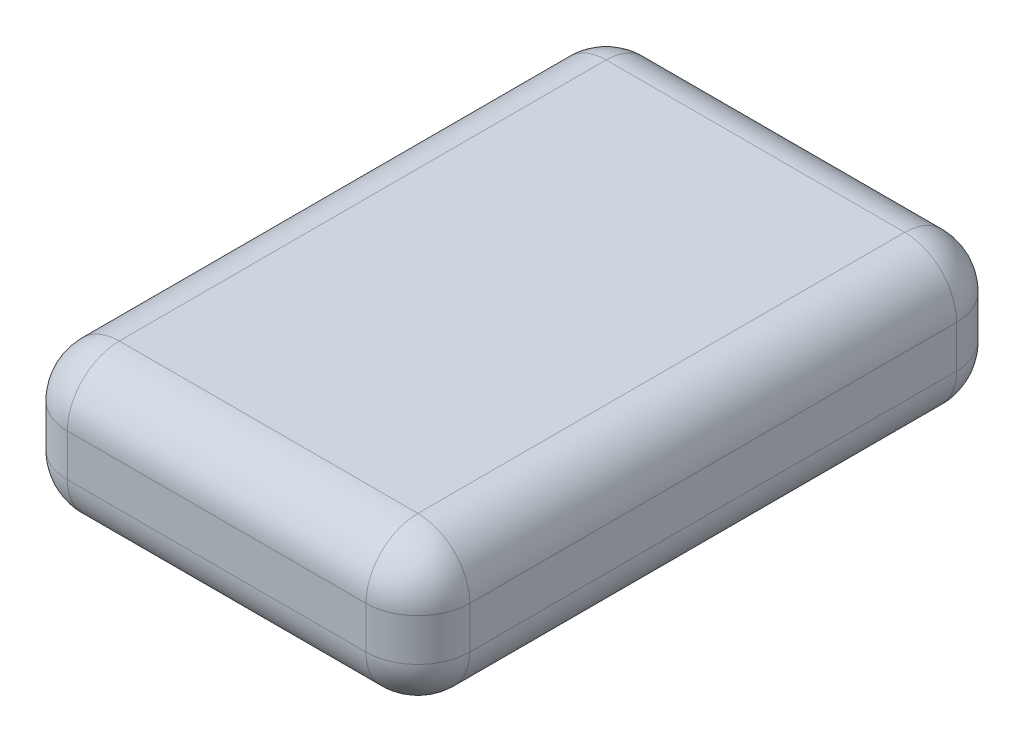
ISO-10303-21;
HEADER;
FILE_DESCRIPTION(('STEP AP214'),'2;1');
FILE_NAME('part.step','',(''),(''),'','','');
FILE_SCHEMA(('AUTOMOTIVE_DESIGN { 1 0 10303 214 1 1 1 1 }'));
ENDSEC;
DATA;
#1=APPLICATION_CONTEXT('core data for automotive mechanical design processes');
#2=APPLICATION_PROTOCOL_DEFINITION('international standard','automotive_design',2000,#1);
#3=PRODUCT_CONTEXT('',#1,'mechanical');
#4=PRODUCT('Part','Part','',(#3));
#5=PRODUCT_RELATED_PRODUCT_CATEGORY('part','',(#4));
#6=PRODUCT_DEFINITION_FORMATION('','',#4);
#7=PRODUCT_DEFINITION_CONTEXT('part definition',#1,'design');
#8=PRODUCT_DEFINITION('design','',#6,#7);
#9=PRODUCT_DEFINITION_SHAPE('','',#8);
#10=(LENGTH_UNIT() NAMED_UNIT(*) SI_UNIT(.MILLI.,.METRE.));
#11=(NAMED_UNIT(*) PLANE_ANGLE_UNIT() SI_UNIT($,.RADIAN.));
#12=(NAMED_UNIT(*) SI_UNIT($,.STERADIAN.) SOLID_ANGLE_UNIT());
#13=UNCERTAINTY_MEASURE_WITH_UNIT(LENGTH_MEASURE(1.E-05),#10,'distance_accuracy_value','');
#14=(GEOMETRIC_REPRESENTATION_CONTEXT(3) GLOBAL_UNCERTAINTY_ASSIGNED_CONTEXT((#13)) GLOBAL_UNIT_ASSIGNED_CONTEXT((#10,
#11,#12)) REPRESENTATION_CONTEXT('',''));
#15=CARTESIAN_POINT('',(0.,0.,0.));
#16=DIRECTION('',(0.,0.,1.));
#17=DIRECTION('',(1.,0.,0.));
#18=AXIS2_PLACEMENT_3D('',#15,#16,#17);
#19=CARTESIAN_POINT('',(31.,22.5,-45.5));
#20=DIRECTION('',(-1.,0.,0.));
#21=DIRECTION('',(0.,0.,1.));
#22=AXIS2_PLACEMENT_3D('',#19,#20,#21);
#23=PLANE('',#22);
#24=DIRECTION('',(0.,0.,-1.));
#25=VECTOR('',#24,1.);
#26=CARTESIAN_POINT('',(31.,8.,-45.5));
#27=LINE('',#26,#25);
#28=CARTESIAN_POINT('',(31.,8.,37.5));
#29=VERTEX_POINT('',#28);
#30=CARTESIAN_POINT('',(31.,8.,-37.5));
#31=VERTEX_POINT('',#30);
#32=EDGE_CURVE('E287',#29,#31,#27,.T.);
#33=ORIENTED_EDGE('',*,*,#32,.T.);
#34=DIRECTION('',(0.,-1.,0.));
#35=VECTOR('',#34,1.);
#36=CARTESIAN_POINT('',(31.,22.5,-37.5));
#37=LINE('',#36,#35);
#38=CARTESIAN_POINT('',(31.,14.5,-37.5));
#39=VERTEX_POINT('',#38);
#40=EDGE_CURVE('E290',#31,#39,#37,.F.);
#41=ORIENTED_EDGE('',*,*,#40,.T.);
#42=DIRECTION('',(0.,0.,-1.));
#43=VECTOR('',#42,1.);
#44=CARTESIAN_POINT('',(31.,14.5,45.5));
#45=LINE('',#44,#43);
#46=CARTESIAN_POINT('',(31.,14.5,37.5));
#47=VERTEX_POINT('',#46);
#48=EDGE_CURVE('E225',#39,#47,#45,.F.);
#49=ORIENTED_EDGE('',*,*,#48,.T.);
#50=DIRECTION('',(0.,-1.,0.));
#51=VECTOR('',#50,1.);
#52=CARTESIAN_POINT('',(31.,22.5,37.5));
#53=LINE('',#52,#51);
#54=EDGE_CURVE('E284',#47,#29,#53,.T.);
#55=ORIENTED_EDGE('',*,*,#54,.T.);
#56=EDGE_LOOP('',(#33,#41,#49,#55));
#57=FACE_BOUND('',#56,.T.);
#58=ADVANCED_FACE('F43',(#57),#23,.F.);
#59=CARTESIAN_POINT('',(-31.,22.5,-45.5));
#60=DIRECTION('',(0.,0.,1.));
#61=DIRECTION('',(1.,0.,0.));
#62=AXIS2_PLACEMENT_3D('',#59,#60,#61);
#63=PLANE('',#62);
#64=DIRECTION('',(-1.,0.,0.));
#65=VECTOR('',#64,1.);
#66=CARTESIAN_POINT('',(-31.,8.,-45.5));
#67=LINE('',#66,#65);
#68=CARTESIAN_POINT('',(23.,8.,-45.5));
#69=VERTEX_POINT('',#68);
#70=CARTESIAN_POINT('',(-23.,8.,-45.5));
#71=VERTEX_POINT('',#70);
#72=EDGE_CURVE('E254',#69,#71,#67,.T.);
#73=ORIENTED_EDGE('',*,*,#72,.T.);
#74=DIRECTION('',(0.,-1.,0.));
#75=VECTOR('',#74,1.);
#76=CARTESIAN_POINT('',(-23.,22.5,-45.5));
#77=LINE('',#76,#75);
#78=CARTESIAN_POINT('',(-23.,14.5,-45.5));
#79=VERTEX_POINT('',#78);
#80=EDGE_CURVE('E258',#71,#79,#77,.F.);
#81=ORIENTED_EDGE('',*,*,#80,.T.);
#82=DIRECTION('',(-1.,0.,0.));
#83=VECTOR('',#82,1.);
#84=CARTESIAN_POINT('',(31.,14.5,-45.5));
#85=LINE('',#84,#83);
#86=CARTESIAN_POINT('',(23.,14.5,-45.5));
#87=VERTEX_POINT('',#86);
#88=EDGE_CURVE('E249',#79,#87,#85,.F.);
#89=ORIENTED_EDGE('',*,*,#88,.T.);
#90=DIRECTION('',(0.,-1.,0.));
#91=VECTOR('',#90,1.);
#92=CARTESIAN_POINT('',(23.,22.5,-45.5));
#93=LINE('',#92,#91);
#94=EDGE_CURVE('E255',#87,#69,#93,.T.);
#95=ORIENTED_EDGE('',*,*,#94,.T.);
#96=EDGE_LOOP('',(#73,#81,#89,#95));
#97=FACE_BOUND('',#96,.T.);
#98=ADVANCED_FACE('F259',(#97),#63,.F.);
#99=CARTESIAN_POINT('',(-31.,22.5,-45.5));
#100=DIRECTION('',(1.,0.,0.));
#101=DIRECTION('',(0.,0.,-1.));
#102=AXIS2_PLACEMENT_3D('',#99,#100,#101);
#103=PLANE('',#102);
#104=DIRECTION('',(0.,0.,1.));
#105=VECTOR('',#104,1.);
#106=CARTESIAN_POINT('',(-31.,14.5,-45.5));
#107=LINE('',#106,#105);
#108=CARTESIAN_POINT('',(-31.,14.5,37.5));
#109=VERTEX_POINT('',#108);
#110=CARTESIAN_POINT('',(-31.,14.5,-37.5));
#111=VERTEX_POINT('',#110);
#112=EDGE_CURVE('E145',#109,#111,#107,.F.);
#113=ORIENTED_EDGE('',*,*,#112,.T.);
#114=DIRECTION('',(0.,-1.,0.));
#115=VECTOR('',#114,1.);
#116=CARTESIAN_POINT('',(-31.,22.5,-37.5));
#117=LINE('',#116,#115);
#118=CARTESIAN_POINT('',(-31.,8.,-37.5));
#119=VERTEX_POINT('',#118);
#120=EDGE_CURVE('E141',#111,#119,#117,.T.);
#121=ORIENTED_EDGE('',*,*,#120,.T.);
#122=DIRECTION('',(0.,0.,1.));
#123=VECTOR('',#122,1.);
#124=CARTESIAN_POINT('',(-31.,8.,-45.5));
#125=LINE('',#124,#123);
#126=CARTESIAN_POINT('',(-31.,8.,37.5));
#127=VERTEX_POINT('',#126);
#128=EDGE_CURVE('E135',#119,#127,#125,.T.);
#129=ORIENTED_EDGE('',*,*,#128,.T.);
#130=DIRECTION('',(0.,-1.,0.));
#131=VECTOR('',#130,1.);
#132=CARTESIAN_POINT('',(-31.,22.5,37.5));
#133=LINE('',#132,#131);
#134=EDGE_CURVE('E138',#127,#109,#133,.F.);
#135=ORIENTED_EDGE('',*,*,#134,.T.);
#136=EDGE_LOOP('',(#113,#121,#129,#135));
#137=FACE_BOUND('',#136,.T.);
#138=ADVANCED_FACE('F137',(#137),#103,.F.);
#139=CARTESIAN_POINT('',(-31.,22.5,45.5));
#140=DIRECTION('',(0.,0.,-1.));
#141=DIRECTION('',(-1.,0.,0.));
#142=AXIS2_PLACEMENT_3D('',#139,#140,#141);
#143=PLANE('',#142);
#144=DIRECTION('',(0.,-1.,0.));
#145=VECTOR('',#144,1.);
#146=CARTESIAN_POINT('',(-23.,22.5,45.5));
#147=LINE('',#146,#145);
#148=CARTESIAN_POINT('',(-23.,14.5,45.5));
#149=VERTEX_POINT('',#148);
#150=CARTESIAN_POINT('',(-23.,8.,45.5));
#151=VERTEX_POINT('',#150);
#152=EDGE_CURVE('E266',#149,#151,#147,.T.);
#153=ORIENTED_EDGE('',*,*,#152,.T.);
#154=DIRECTION('',(1.,0.,0.));
#155=VECTOR('',#154,1.);
#156=CARTESIAN_POINT('',(-31.,8.,45.5));
#157=LINE('',#156,#155);
#158=CARTESIAN_POINT('',(23.,8.,45.5));
#159=VERTEX_POINT('',#158);
#160=EDGE_CURVE('E273',#151,#159,#157,.T.);
#161=ORIENTED_EDGE('',*,*,#160,.T.);
#162=DIRECTION('',(0.,-1.,0.));
#163=VECTOR('',#162,1.);
#164=CARTESIAN_POINT('',(23.,22.5,45.5));
#165=LINE('',#164,#163);
#166=CARTESIAN_POINT('',(23.,14.5,45.5));
#167=VERTEX_POINT('',#166);
#168=EDGE_CURVE('E271',#159,#167,#165,.F.);
#169=ORIENTED_EDGE('',*,*,#168,.T.);
#170=DIRECTION('',(1.,0.,0.));
#171=VECTOR('',#170,1.);
#172=CARTESIAN_POINT('',(-31.,14.5,45.5));
#173=LINE('',#172,#171);
#174=EDGE_CURVE('E264',#167,#149,#173,.F.);
#175=ORIENTED_EDGE('',*,*,#174,.T.);
#176=EDGE_LOOP('',(#153,#161,#169,#175));
#177=FACE_BOUND('',#176,.T.);
#178=ADVANCED_FACE('F297',(#177),#143,.F.);
#179=CARTESIAN_POINT('',(0.,22.5,0.));
#180=DIRECTION('',(0.,1.,0.));
#181=DIRECTION('',(0.,0.,1.));
#182=AXIS2_PLACEMENT_3D('',#179,#180,#181);
#183=PLANE('',#182);
#184=DIRECTION('',(0.,0.,-1.));
#185=VECTOR('',#184,1.);
#186=CARTESIAN_POINT('',(23.,22.5,-45.5));
#187=LINE('',#186,#185);
#188=CARTESIAN_POINT('',(23.,22.5,37.5));
#189=VERTEX_POINT('',#188);
#190=CARTESIAN_POINT('',(23.,22.5,-37.5));
#191=VERTEX_POINT('',#190);
#192=EDGE_CURVE('E52',#189,#191,#187,.T.);
#193=ORIENTED_EDGE('',*,*,#192,.T.);
#194=DIRECTION('',(-1.,0.,0.));
#195=VECTOR('',#194,1.);
#196=CARTESIAN_POINT('',(-31.,22.5,-37.5));
#197=LINE('',#196,#195);
#198=CARTESIAN_POINT('',(-23.,22.5,-37.5));
#199=VERTEX_POINT('',#198);
#200=EDGE_CURVE('E11',#191,#199,#197,.T.);
#201=ORIENTED_EDGE('',*,*,#200,.T.);
#202=DIRECTION('',(0.,0.,1.));
#203=VECTOR('',#202,1.);
#204=CARTESIAN_POINT('',(-23.,22.5,45.5));
#205=LINE('',#204,#203);
#206=CARTESIAN_POINT('',(-23.,22.5,37.5));
#207=VERTEX_POINT('',#206);
#208=EDGE_CURVE('E228',#199,#207,#205,.T.);
#209=ORIENTED_EDGE('',*,*,#208,.T.);
#210=DIRECTION('',(1.,0.,0.));
#211=VECTOR('',#210,1.);
#212=CARTESIAN_POINT('',(31.,22.5,37.5));
#213=LINE('',#212,#211);
#214=EDGE_CURVE('E230',#207,#189,#213,.T.);
#215=ORIENTED_EDGE('',*,*,#214,.T.);
#216=EDGE_LOOP('',(#193,#201,#209,#215));
#217=FACE_BOUND('',#216,.T.);
#218=ADVANCED_FACE('F292',(#217),#183,.T.);
#219=CARTESIAN_POINT('',(0.,0.,0.));
#220=DIRECTION('',(0.,1.,0.));
#221=DIRECTION('',(0.,0.,1.));
#222=AXIS2_PLACEMENT_3D('',#219,#220,#221);
#223=PLANE('',#222);
#224=DIRECTION('',(0.,0.,-1.));
#225=VECTOR('',#224,1.);
#226=CARTESIAN_POINT('',(23.,0.,0.));
#227=LINE('',#226,#225);
#228=CARTESIAN_POINT('',(23.,0.,-37.5));
#229=VERTEX_POINT('',#228);
#230=CARTESIAN_POINT('',(23.,0.,37.5));
#231=VERTEX_POINT('',#230);
#232=EDGE_CURVE('E279',#229,#231,#227,.F.);
#233=ORIENTED_EDGE('',*,*,#232,.T.);
#234=DIRECTION('',(1.,0.,0.));
#235=VECTOR('',#234,1.);
#236=CARTESIAN_POINT('',(0.,0.,37.5));
#237=LINE('',#236,#235);
#238=CARTESIAN_POINT('',(-23.,0.,37.5));
#239=VERTEX_POINT('',#238);
#240=EDGE_CURVE('E281',#231,#239,#237,.F.);
#241=ORIENTED_EDGE('',*,*,#240,.T.);
#242=DIRECTION('',(0.,0.,1.));
#243=VECTOR('',#242,1.);
#244=CARTESIAN_POINT('',(-23.,0.,0.));
#245=LINE('',#244,#243);
#246=CARTESIAN_POINT('',(-23.,0.,-37.5));
#247=VERTEX_POINT('',#246);
#248=EDGE_CURVE('E166',#239,#247,#245,.F.);
#249=ORIENTED_EDGE('',*,*,#248,.T.);
#250=DIRECTION('',(-1.,0.,0.));
#251=VECTOR('',#250,1.);
#252=CARTESIAN_POINT('',(0.,0.,-37.5));
#253=LINE('',#252,#251);
#254=EDGE_CURVE('E276',#247,#229,#253,.F.);
#255=ORIENTED_EDGE('',*,*,#254,.T.);
#256=EDGE_LOOP('',(#233,#241,#249,#255));
#257=FACE_BOUND('',#256,.T.);
#258=ADVANCED_FACE('F482',(#257),#223,.F.);
#259=CARTESIAN_POINT('',(23.,22.5,37.5));
#260=DIRECTION('',(0.,-1.,0.));
#261=DIRECTION('',(0.,0.,-1.));
#262=AXIS2_PLACEMENT_3D('',#259,#260,#261);
#263=CYLINDRICAL_SURFACE('',#262,8.);
#264=CARTESIAN_POINT('',(23.,14.5,37.5));
#265=DIRECTION('',(0.,1.,0.));
#266=DIRECTION('',(0.,0.,1.));
#267=AXIS2_PLACEMENT_3D('',#264,#265,#266);
#268=CIRCLE('',#267,8.);
#269=EDGE_CURVE('E47',#167,#47,#268,.T.);
#270=ORIENTED_EDGE('',*,*,#269,.F.);
#271=ORIENTED_EDGE('',*,*,#168,.F.);
#272=CARTESIAN_POINT('',(23.,8.,37.5));
#273=DIRECTION('',(0.,-1.,0.));
#274=DIRECTION('',(0.,0.,-1.));
#275=AXIS2_PLACEMENT_3D('',#272,#273,#274);
#276=CIRCLE('',#275,8.);
#277=EDGE_CURVE('E206',#29,#159,#276,.T.);
#278=ORIENTED_EDGE('',*,*,#277,.F.);
#279=ORIENTED_EDGE('',*,*,#54,.F.);
#280=EDGE_LOOP('',(#270,#271,#278,#279));
#281=FACE_BOUND('',#280,.T.);
#282=ADVANCED_FACE('F45',(#281),#263,.T.);
#283=CARTESIAN_POINT('',(23.,14.5,37.5));
#284=DIRECTION('',(1.,0.,0.));
#285=DIRECTION('',(0.,0.,-1.));
#286=AXIS2_PLACEMENT_3D('',#283,#284,#285);
#287=SPHERICAL_SURFACE('',#286,8.);
#288=CARTESIAN_POINT('',(23.,14.5,37.5));
#289=DIRECTION('',(1.,0.,0.));
#290=DIRECTION('',(0.,0.,-1.));
#291=AXIS2_PLACEMENT_3D('',#288,#289,#290);
#292=CIRCLE('',#291,8.);
#293=EDGE_CURVE('E201',#167,#189,#292,.F.);
#294=ORIENTED_EDGE('',*,*,#293,.F.);
#295=ORIENTED_EDGE('',*,*,#269,.T.);
#296=CARTESIAN_POINT('',(23.,14.5,37.5));
#297=DIRECTION('',(0.,0.,1.));
#298=DIRECTION('',(0.,-1.,0.));
#299=AXIS2_PLACEMENT_3D('',#296,#297,#298);
#300=CIRCLE('',#299,8.);
#301=EDGE_CURVE('E204',#189,#47,#300,.F.);
#302=ORIENTED_EDGE('',*,*,#301,.F.);
#303=EDGE_LOOP('',(#294,#295,#302));
#304=FACE_BOUND('',#303,.T.);
#305=ADVANCED_FACE('F218',(#304),#287,.T.);
#306=CARTESIAN_POINT('',(23.,8.,37.5));
#307=DIRECTION('',(0.,0.,1.));
#308=DIRECTION('',(1.,0.,0.));
#309=AXIS2_PLACEMENT_3D('',#306,#307,#308);
#310=SPHERICAL_SURFACE('',#309,8.);
#311=CARTESIAN_POINT('',(23.,8.,37.5));
#312=DIRECTION('',(0.,0.,1.));
#313=DIRECTION('',(1.,0.,0.));
#314=AXIS2_PLACEMENT_3D('',#311,#312,#313);
#315=CIRCLE('',#314,8.);
#316=EDGE_CURVE('E196',#29,#231,#315,.F.);
#317=ORIENTED_EDGE('',*,*,#316,.F.);
#318=ORIENTED_EDGE('',*,*,#277,.T.);
#319=CARTESIAN_POINT('',(23.,8.,37.5));
#320=DIRECTION('',(1.,0.,0.));
#321=DIRECTION('',(0.,0.,-1.));
#322=AXIS2_PLACEMENT_3D('',#319,#320,#321);
#323=CIRCLE('',#322,8.);
#324=EDGE_CURVE('E199',#231,#159,#323,.F.);
#325=ORIENTED_EDGE('',*,*,#324,.F.);
#326=EDGE_LOOP('',(#317,#318,#325));
#327=FACE_BOUND('',#326,.T.);
#328=ADVANCED_FACE('F300',(#327),#310,.T.);
#329=CARTESIAN_POINT('',(23.,14.5,0.));
#330=DIRECTION('',(0.,0.,1.));
#331=DIRECTION('',(1.,0.,0.));
#332=AXIS2_PLACEMENT_3D('',#329,#330,#331);
#333=CYLINDRICAL_SURFACE('',#332,8.);
#334=ORIENTED_EDGE('',*,*,#301,.T.);
#335=ORIENTED_EDGE('',*,*,#48,.F.);
#336=CARTESIAN_POINT('',(23.,14.5,-37.5));
#337=DIRECTION('',(0.,0.,-1.));
#338=DIRECTION('',(-1.,0.,0.));
#339=AXIS2_PLACEMENT_3D('',#336,#337,#338);
#340=CIRCLE('',#339,8.);
#341=EDGE_CURVE('E190',#191,#39,#340,.T.);
#342=ORIENTED_EDGE('',*,*,#341,.F.);
#343=ORIENTED_EDGE('',*,*,#192,.F.);
#344=EDGE_LOOP('',(#334,#335,#342,#343));
#345=FACE_BOUND('',#344,.T.);
#346=ADVANCED_FACE('F224',(#345),#333,.T.);
#347=CARTESIAN_POINT('',(0.,14.5,37.5));
#348=DIRECTION('',(-1.,0.,0.));
#349=DIRECTION('',(0.,0.,1.));
#350=AXIS2_PLACEMENT_3D('',#347,#348,#349);
#351=CYLINDRICAL_SURFACE('',#350,8.);
#352=ORIENTED_EDGE('',*,*,#293,.T.);
#353=ORIENTED_EDGE('',*,*,#214,.F.);
#354=CARTESIAN_POINT('',(-23.,14.5,37.5));
#355=DIRECTION('',(-1.,0.,0.));
#356=DIRECTION('',(0.,0.,1.));
#357=AXIS2_PLACEMENT_3D('',#354,#355,#356);
#358=CIRCLE('',#357,8.);
#359=EDGE_CURVE('E187',#149,#207,#358,.T.);
#360=ORIENTED_EDGE('',*,*,#359,.F.);
#361=ORIENTED_EDGE('',*,*,#174,.F.);
#362=EDGE_LOOP('',(#352,#353,#360,#361));
#363=FACE_BOUND('',#362,.T.);
#364=ADVANCED_FACE('F295',(#363),#351,.T.);
#365=CARTESIAN_POINT('',(-23.,22.5,37.5));
#366=DIRECTION('',(0.,-1.,0.));
#367=DIRECTION('',(0.,0.,-1.));
#368=AXIS2_PLACEMENT_3D('',#365,#366,#367);
#369=CYLINDRICAL_SURFACE('',#368,8.);
#370=CARTESIAN_POINT('',(-23.,8.,37.5));
#371=DIRECTION('',(0.,-1.,0.));
#372=DIRECTION('',(0.,0.,-1.));
#373=AXIS2_PLACEMENT_3D('',#370,#371,#372);
#374=CIRCLE('',#373,8.);
#375=EDGE_CURVE('E152',#151,#127,#374,.T.);
#376=ORIENTED_EDGE('',*,*,#375,.F.);
#377=ORIENTED_EDGE('',*,*,#152,.F.);
#378=CARTESIAN_POINT('',(-23.,14.5,37.5));
#379=DIRECTION('',(0.,1.,0.));
#380=DIRECTION('',(0.,0.,1.));
#381=AXIS2_PLACEMENT_3D('',#378,#379,#380);
#382=CIRCLE('',#381,8.);
#383=EDGE_CURVE('E155',#109,#149,#382,.T.);
#384=ORIENTED_EDGE('',*,*,#383,.F.);
#385=ORIENTED_EDGE('',*,*,#134,.F.);
#386=EDGE_LOOP('',(#376,#377,#384,#385));
#387=FACE_BOUND('',#386,.T.);
#388=ADVANCED_FACE('F150',(#387),#369,.T.);
#389=CARTESIAN_POINT('',(-31.,8.,37.5));
#390=DIRECTION('',(1.,0.,0.));
#391=DIRECTION('',(0.,0.,-1.));
#392=AXIS2_PLACEMENT_3D('',#389,#390,#391);
#393=CYLINDRICAL_SURFACE('',#392,8.);
#394=ORIENTED_EDGE('',*,*,#324,.T.);
#395=ORIENTED_EDGE('',*,*,#160,.F.);
#396=CARTESIAN_POINT('',(-23.,8.,37.5));
#397=DIRECTION('',(-1.,0.,0.));
#398=DIRECTION('',(0.,0.,1.));
#399=AXIS2_PLACEMENT_3D('',#396,#397,#398);
#400=CIRCLE('',#399,8.);
#401=EDGE_CURVE('E163',#239,#151,#400,.T.);
#402=ORIENTED_EDGE('',*,*,#401,.F.);
#403=ORIENTED_EDGE('',*,*,#240,.F.);
#404=EDGE_LOOP('',(#394,#395,#402,#403));
#405=FACE_BOUND('',#404,.T.);
#406=ADVANCED_FACE('F432',(#405),#393,.T.);
#407=CARTESIAN_POINT('',(23.,8.,-45.5));
#408=DIRECTION('',(0.,0.,-1.));
#409=DIRECTION('',(-1.,0.,0.));
#410=AXIS2_PLACEMENT_3D('',#407,#408,#409);
#411=CYLINDRICAL_SURFACE('',#410,8.);
#412=ORIENTED_EDGE('',*,*,#316,.T.);
#413=ORIENTED_EDGE('',*,*,#232,.F.);
#414=CARTESIAN_POINT('',(23.,8.,-37.5));
#415=DIRECTION('',(0.,0.,-1.));
#416=DIRECTION('',(-1.,0.,0.));
#417=AXIS2_PLACEMENT_3D('',#414,#415,#416);
#418=CIRCLE('',#417,8.);
#419=EDGE_CURVE('E182',#31,#229,#418,.T.);
#420=ORIENTED_EDGE('',*,*,#419,.F.);
#421=ORIENTED_EDGE('',*,*,#32,.F.);
#422=EDGE_LOOP('',(#412,#413,#420,#421));
#423=FACE_BOUND('',#422,.T.);
#424=ADVANCED_FACE('F305',(#423),#411,.T.);
#425=CARTESIAN_POINT('',(23.,22.5,-37.5));
#426=DIRECTION('',(0.,-1.,0.));
#427=DIRECTION('',(0.,0.,-1.));
#428=AXIS2_PLACEMENT_3D('',#425,#426,#427);
#429=CYLINDRICAL_SURFACE('',#428,8.);
#430=CARTESIAN_POINT('',(23.,14.5,-37.5));
#431=DIRECTION('',(0.,1.,0.));
#432=DIRECTION('',(0.,0.,1.));
#433=AXIS2_PLACEMENT_3D('',#430,#431,#432);
#434=CIRCLE('',#433,8.);
#435=EDGE_CURVE('E193',#39,#87,#434,.T.);
#436=ORIENTED_EDGE('',*,*,#435,.F.);
#437=ORIENTED_EDGE('',*,*,#40,.F.);
#438=CARTESIAN_POINT('',(23.,8.,-37.5));
#439=DIRECTION('',(0.,-1.,0.));
#440=DIRECTION('',(0.,0.,-1.));
#441=AXIS2_PLACEMENT_3D('',#438,#439,#440);
#442=CIRCLE('',#441,8.);
#443=EDGE_CURVE('E180',#69,#31,#442,.T.);
#444=ORIENTED_EDGE('',*,*,#443,.F.);
#445=ORIENTED_EDGE('',*,*,#94,.F.);
#446=EDGE_LOOP('',(#436,#437,#444,#445));
#447=FACE_BOUND('',#446,.T.);
#448=ADVANCED_FACE('F310',(#447),#429,.T.);
#449=CARTESIAN_POINT('',(23.,14.5,-37.5));
#450=DIRECTION('',(1.,0.,0.));
#451=DIRECTION('',(0.,0.,-1.));
#452=AXIS2_PLACEMENT_3D('',#449,#450,#451);
#453=SPHERICAL_SURFACE('',#452,8.);
#454=ORIENTED_EDGE('',*,*,#341,.T.);
#455=ORIENTED_EDGE('',*,*,#435,.T.);
#456=CARTESIAN_POINT('',(23.,14.5,-37.5));
#457=DIRECTION('',(1.,0.,0.));
#458=DIRECTION('',(0.,1.,0.));
#459=AXIS2_PLACEMENT_3D('',#456,#457,#458);
#460=CIRCLE('',#459,8.);
#461=EDGE_CURVE('E171',#191,#87,#460,.F.);
#462=ORIENTED_EDGE('',*,*,#461,.F.);
#463=EDGE_LOOP('',(#454,#455,#462));
#464=FACE_BOUND('',#463,.T.);
#465=ADVANCED_FACE('F313',(#464),#453,.T.);
#466=CARTESIAN_POINT('',(-23.,14.5,37.5));
#467=DIRECTION('',(0.,0.,1.));
#468=DIRECTION('',(1.,0.,0.));
#469=AXIS2_PLACEMENT_3D('',#466,#467,#468);
#470=SPHERICAL_SURFACE('',#469,8.);
#471=ORIENTED_EDGE('',*,*,#383,.T.);
#472=ORIENTED_EDGE('',*,*,#359,.T.);
#473=CARTESIAN_POINT('',(-23.,14.5,37.5));
#474=DIRECTION('',(0.,0.,1.));
#475=DIRECTION('',(1.,0.,0.));
#476=AXIS2_PLACEMENT_3D('',#473,#474,#475);
#477=CIRCLE('',#476,8.);
#478=EDGE_CURVE('E167',#109,#207,#477,.F.);
#479=ORIENTED_EDGE('',*,*,#478,.F.);
#480=EDGE_LOOP('',(#471,#472,#479));
#481=FACE_BOUND('',#480,.T.);
#482=ADVANCED_FACE('F315',(#481),#470,.T.);
#483=CARTESIAN_POINT('',(-23.,8.,37.5));
#484=DIRECTION('',(0.,0.,1.));
#485=DIRECTION('',(1.,0.,0.));
#486=AXIS2_PLACEMENT_3D('',#483,#484,#485);
#487=SPHERICAL_SURFACE('',#486,8.);
#488=ORIENTED_EDGE('',*,*,#401,.T.);
#489=ORIENTED_EDGE('',*,*,#375,.T.);
#490=CARTESIAN_POINT('',(-23.,8.,37.5));
#491=DIRECTION('',(0.,0.,1.));
#492=DIRECTION('',(1.,0.,0.));
#493=AXIS2_PLACEMENT_3D('',#490,#491,#492);
#494=CIRCLE('',#493,8.);
#495=EDGE_CURVE('E161',#239,#127,#494,.F.);
#496=ORIENTED_EDGE('',*,*,#495,.F.);
#497=EDGE_LOOP('',(#488,#489,#496));
#498=FACE_BOUND('',#497,.T.);
#499=ADVANCED_FACE('F160',(#498),#487,.T.);
#500=CARTESIAN_POINT('',(23.,8.,-37.5));
#501=DIRECTION('',(1.,0.,0.));
#502=DIRECTION('',(0.,0.,-1.));
#503=AXIS2_PLACEMENT_3D('',#500,#501,#502);
#504=SPHERICAL_SURFACE('',#503,8.);
#505=ORIENTED_EDGE('',*,*,#443,.T.);
#506=ORIENTED_EDGE('',*,*,#419,.T.);
#507=CARTESIAN_POINT('',(23.,8.,-37.5));
#508=DIRECTION('',(1.,0.,0.));
#509=DIRECTION('',(0.,0.,-1.));
#510=AXIS2_PLACEMENT_3D('',#507,#508,#509);
#511=CIRCLE('',#510,8.);
#512=EDGE_CURVE('E168',#69,#229,#511,.F.);
#513=ORIENTED_EDGE('',*,*,#512,.F.);
#514=EDGE_LOOP('',(#505,#506,#513));
#515=FACE_BOUND('',#514,.T.);
#516=ADVANCED_FACE('F353',(#515),#504,.T.);
#517=CARTESIAN_POINT('',(0.,14.5,-37.5));
#518=DIRECTION('',(1.,0.,0.));
#519=DIRECTION('',(0.,0.,-1.));
#520=AXIS2_PLACEMENT_3D('',#517,#518,#519);
#521=CYLINDRICAL_SURFACE('',#520,8.);
#522=ORIENTED_EDGE('',*,*,#461,.T.);
#523=ORIENTED_EDGE('',*,*,#88,.F.);
#524=CARTESIAN_POINT('',(-23.,14.5,-37.5));
#525=DIRECTION('',(-1.,0.,0.));
#526=DIRECTION('',(0.,0.,1.));
#527=AXIS2_PLACEMENT_3D('',#524,#525,#526);
#528=CIRCLE('',#527,8.);
#529=EDGE_CURVE('E174',#199,#79,#528,.T.);
#530=ORIENTED_EDGE('',*,*,#529,.F.);
#531=ORIENTED_EDGE('',*,*,#200,.F.);
#532=EDGE_LOOP('',(#522,#523,#530,#531));
#533=FACE_BOUND('',#532,.T.);
#534=ADVANCED_FACE('F251',(#533),#521,.T.);
#535=CARTESIAN_POINT('',(-23.,14.5,0.));
#536=DIRECTION('',(0.,0.,-1.));
#537=DIRECTION('',(-1.,0.,0.));
#538=AXIS2_PLACEMENT_3D('',#535,#536,#537);
#539=CYLINDRICAL_SURFACE('',#538,8.);
#540=ORIENTED_EDGE('',*,*,#478,.T.);
#541=ORIENTED_EDGE('',*,*,#208,.F.);
#542=CARTESIAN_POINT('',(-23.,14.5,-37.5));
#543=DIRECTION('',(0.,0.,-1.));
#544=DIRECTION('',(-1.,0.,0.));
#545=AXIS2_PLACEMENT_3D('',#542,#543,#544);
#546=CIRCLE('',#545,8.);
#547=EDGE_CURVE('E66',#111,#199,#546,.T.);
#548=ORIENTED_EDGE('',*,*,#547,.F.);
#549=ORIENTED_EDGE('',*,*,#112,.F.);
#550=EDGE_LOOP('',(#540,#541,#548,#549));
#551=FACE_BOUND('',#550,.T.);
#552=ADVANCED_FACE('F347',(#551),#539,.T.);
#553=CARTESIAN_POINT('',(-23.,8.,-45.5));
#554=DIRECTION('',(0.,0.,1.));
#555=DIRECTION('',(1.,0.,0.));
#556=AXIS2_PLACEMENT_3D('',#553,#554,#555);
#557=CYLINDRICAL_SURFACE('',#556,8.);
#558=ORIENTED_EDGE('',*,*,#495,.T.);
#559=ORIENTED_EDGE('',*,*,#128,.F.);
#560=CARTESIAN_POINT('',(-23.,8.,-37.5));
#561=DIRECTION('',(0.,0.,-1.));
#562=DIRECTION('',(-1.,0.,0.));
#563=AXIS2_PLACEMENT_3D('',#560,#561,#562);
#564=CIRCLE('',#563,8.);
#565=EDGE_CURVE('E241',#247,#119,#564,.T.);
#566=ORIENTED_EDGE('',*,*,#565,.F.);
#567=ORIENTED_EDGE('',*,*,#248,.F.);
#568=EDGE_LOOP('',(#558,#559,#566,#567));
#569=FACE_BOUND('',#568,.T.);
#570=ADVANCED_FACE('F165',(#569),#557,.T.);
#571=CARTESIAN_POINT('',(-31.,8.,-37.5));
#572=DIRECTION('',(-1.,0.,0.));
#573=DIRECTION('',(0.,0.,1.));
#574=AXIS2_PLACEMENT_3D('',#571,#572,#573);
#575=CYLINDRICAL_SURFACE('',#574,8.);
#576=ORIENTED_EDGE('',*,*,#512,.T.);
#577=ORIENTED_EDGE('',*,*,#254,.F.);
#578=CARTESIAN_POINT('',(-23.,8.,-37.5));
#579=DIRECTION('',(-1.,0.,0.));
#580=DIRECTION('',(0.,0.,1.));
#581=AXIS2_PLACEMENT_3D('',#578,#579,#580);
#582=CIRCLE('',#581,8.);
#583=EDGE_CURVE('E238',#71,#247,#582,.T.);
#584=ORIENTED_EDGE('',*,*,#583,.F.);
#585=ORIENTED_EDGE('',*,*,#72,.F.);
#586=EDGE_LOOP('',(#576,#577,#584,#585));
#587=FACE_BOUND('',#586,.T.);
#588=ADVANCED_FACE('F341',(#587),#575,.T.);
#589=CARTESIAN_POINT('',(-23.,14.5,-37.5));
#590=DIRECTION('',(0.,1.,0.));
#591=DIRECTION('',(0.,0.,1.));
#592=AXIS2_PLACEMENT_3D('',#589,#590,#591);
#593=SPHERICAL_SURFACE('',#592,8.);
#594=ORIENTED_EDGE('',*,*,#547,.T.);
#595=ORIENTED_EDGE('',*,*,#529,.T.);
#596=CARTESIAN_POINT('',(-23.,14.5,-37.5));
#597=DIRECTION('',(0.,1.,0.));
#598=DIRECTION('',(0.,0.,1.));
#599=AXIS2_PLACEMENT_3D('',#596,#597,#598);
#600=CIRCLE('',#599,8.);
#601=EDGE_CURVE('E236',#111,#79,#600,.F.);
#602=ORIENTED_EDGE('',*,*,#601,.F.);
#603=EDGE_LOOP('',(#594,#595,#602));
#604=FACE_BOUND('',#603,.T.);
#605=ADVANCED_FACE('F245',(#604),#593,.T.);
#606=CARTESIAN_POINT('',(-23.,8.,-37.5));
#607=DIRECTION('',(0.,-1.,0.));
#608=DIRECTION('',(0.,0.,-1.));
#609=AXIS2_PLACEMENT_3D('',#606,#607,#608);
#610=SPHERICAL_SURFACE('',#609,8.);
#611=ORIENTED_EDGE('',*,*,#583,.T.);
#612=ORIENTED_EDGE('',*,*,#565,.T.);
#613=CARTESIAN_POINT('',(-23.,8.,-37.5));
#614=DIRECTION('',(0.,-1.,0.));
#615=DIRECTION('',(0.,0.,-1.));
#616=AXIS2_PLACEMENT_3D('',#613,#614,#615);
#617=CIRCLE('',#616,8.);
#618=EDGE_CURVE('E234',#71,#119,#617,.F.);
#619=ORIENTED_EDGE('',*,*,#618,.F.);
#620=EDGE_LOOP('',(#611,#612,#619));
#621=FACE_BOUND('',#620,.T.);
#622=ADVANCED_FACE('F335',(#621),#610,.T.);
#623=CARTESIAN_POINT('',(-23.,22.5,-37.5));
#624=DIRECTION('',(0.,-1.,0.));
#625=DIRECTION('',(0.,0.,-1.));
#626=AXIS2_PLACEMENT_3D('',#623,#624,#625);
#627=CYLINDRICAL_SURFACE('',#626,8.);
#628=ORIENTED_EDGE('',*,*,#601,.T.);
#629=ORIENTED_EDGE('',*,*,#80,.F.);
#630=ORIENTED_EDGE('',*,*,#618,.T.);
#631=ORIENTED_EDGE('',*,*,#120,.F.);
#632=EDGE_LOOP('',(#628,#629,#630,#631));
#633=FACE_BOUND('',#632,.T.);
#634=ADVANCED_FACE('F332',(#633),#627,.T.);
#635=CLOSED_SHELL('',(#58,#98,#138,#178,#218,#258,#282,#305,#328,#346,#364,#388,#406,#424,#448,
#465,#482,#499,#516,#534,#552,#570,#588,#605,#622,#634));
#636=MANIFOLD_SOLID_BREP('B2',#635);
#637=ADVANCED_BREP_SHAPE_REPRESENTATION('',(#18,#636),#14);
#638=SHAPE_DEFINITION_REPRESENTATION(#9,#637);
ENDSEC;
END-ISO-10303-21;
